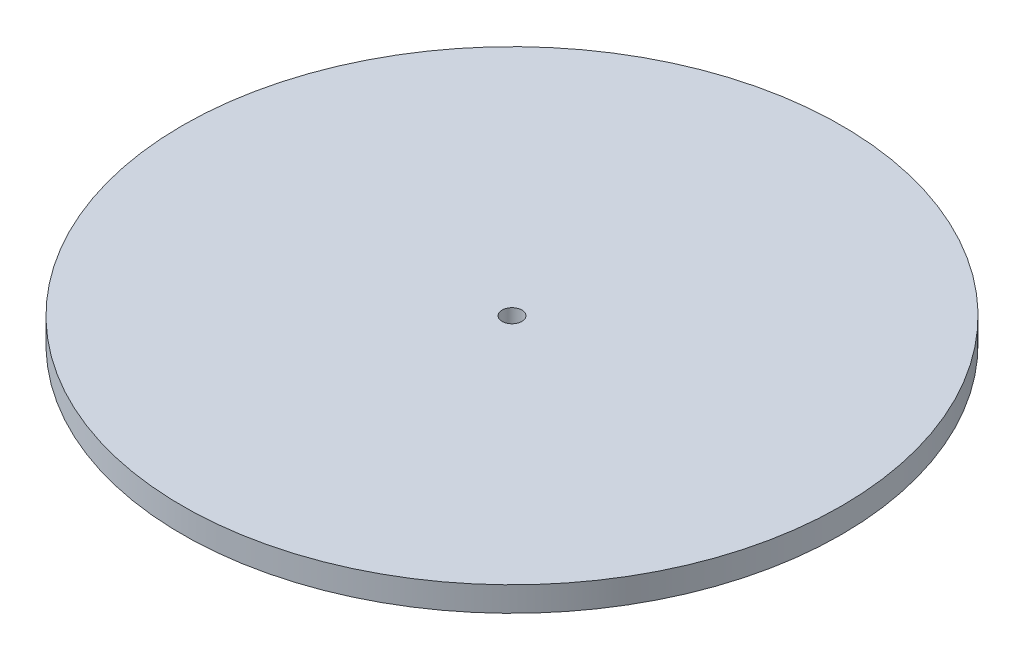
ISO-10303-21;
HEADER;
FILE_DESCRIPTION(('STEP AP214'),'2;1');
FILE_NAME('part.step','',(''),(''),'','','');
FILE_SCHEMA(('AUTOMOTIVE_DESIGN { 1 0 10303 214 1 1 1 1 }'));
ENDSEC;
DATA;
#1=APPLICATION_CONTEXT('core data for automotive mechanical design processes');
#2=APPLICATION_PROTOCOL_DEFINITION('international standard','automotive_design',2000,#1);
#3=PRODUCT_CONTEXT('',#1,'mechanical');
#4=PRODUCT('Part','Part','',(#3));
#5=PRODUCT_RELATED_PRODUCT_CATEGORY('part','',(#4));
#6=PRODUCT_DEFINITION_FORMATION('','',#4);
#7=PRODUCT_DEFINITION_CONTEXT('part definition',#1,'design');
#8=PRODUCT_DEFINITION('design','',#6,#7);
#9=PRODUCT_DEFINITION_SHAPE('','',#8);
#10=(LENGTH_UNIT() NAMED_UNIT(*) SI_UNIT(.MILLI.,.METRE.));
#11=(NAMED_UNIT(*) PLANE_ANGLE_UNIT() SI_UNIT($,.RADIAN.));
#12=(NAMED_UNIT(*) SI_UNIT($,.STERADIAN.) SOLID_ANGLE_UNIT());
#13=UNCERTAINTY_MEASURE_WITH_UNIT(LENGTH_MEASURE(1.E-05),#10,'distance_accuracy_value','');
#14=(GEOMETRIC_REPRESENTATION_CONTEXT(3) GLOBAL_UNCERTAINTY_ASSIGNED_CONTEXT((#13)) GLOBAL_UNIT_ASSIGNED_CONTEXT((#10,
#11,#12)) REPRESENTATION_CONTEXT('',''));
#15=CARTESIAN_POINT('',(0.,0.,0.));
#16=DIRECTION('',(0.,0.,1.));
#17=DIRECTION('',(1.,0.,0.));
#18=AXIS2_PLACEMENT_3D('',#15,#16,#17);
#19=CARTESIAN_POINT('',(0.,10.6124436187396,0.));
#20=DIRECTION('',(0.,1.,0.));
#21=DIRECTION('',(-1.,0.,0.));
#22=AXIS2_PLACEMENT_3D('',#19,#20,#21);
#23=CYLINDRICAL_SURFACE('',#22,40.);
#24=CARTESIAN_POINT('',(0.,10.6124436187397,0.));
#25=DIRECTION('',(0.,1.,0.));
#26=DIRECTION('',(-1.,0.,0.));
#27=AXIS2_PLACEMENT_3D('',#24,#25,#26);
#28=CIRCLE('',#27,40.);
#29=CARTESIAN_POINT('',(-40.,10.6124436187397,0.));
#30=VERTEX_POINT('',#29);
#31=EDGE_CURVE('E50',#30,#30,#28,.T.);
#32=ORIENTED_EDGE('',*,*,#31,.F.);
#33=EDGE_LOOP('',(#32));
#34=FACE_BOUND('',#33,.T.);
#35=CARTESIAN_POINT('',(0.,7.61244361873965,0.));
#36=DIRECTION('',(0.,1.,0.));
#37=DIRECTION('',(-1.,0.,0.));
#38=AXIS2_PLACEMENT_3D('',#35,#36,#37);
#39=CIRCLE('',#38,40.);
#40=CARTESIAN_POINT('',(-40.,7.61244361873965,0.));
#41=VERTEX_POINT('',#40);
#42=EDGE_CURVE('E10',#41,#41,#39,.T.);
#43=ORIENTED_EDGE('',*,*,#42,.T.);
#44=EDGE_LOOP('',(#43));
#45=FACE_BOUND('',#44,.T.);
#46=ADVANCED_FACE('F31',(#34,#45),#23,.T.);
#47=CARTESIAN_POINT('',(37.,7.61244361873965,0.));
#48=DIRECTION('',(0.,1.,0.));
#49=DIRECTION('',(-1.,0.,0.));
#50=AXIS2_PLACEMENT_3D('',#47,#48,#49);
#51=PLANE('',#50);
#52=ORIENTED_EDGE('',*,*,#42,.F.);
#53=EDGE_LOOP('',(#52));
#54=FACE_BOUND('',#53,.T.);
#55=CARTESIAN_POINT('',(0.,7.61244361873965,0.));
#56=DIRECTION('',(0.,1.,0.));
#57=DIRECTION('',(-1.,0.,0.));
#58=AXIS2_PLACEMENT_3D('',#55,#56,#57);
#59=CIRCLE('',#58,37.);
#60=CARTESIAN_POINT('',(-37.,7.61244361873965,0.));
#61=VERTEX_POINT('',#60);
#62=EDGE_CURVE('E37',#61,#61,#59,.T.);
#63=ORIENTED_EDGE('',*,*,#62,.T.);
#64=EDGE_LOOP('',(#63));
#65=FACE_BOUND('',#64,.T.);
#66=ADVANCED_FACE('F71',(#54,#65),#51,.F.);
#67=CARTESIAN_POINT('',(0.,10.6124436187396,0.));
#68=DIRECTION('',(0.,1.,0.));
#69=DIRECTION('',(-1.,0.,0.));
#70=AXIS2_PLACEMENT_3D('',#67,#68,#69);
#71=CYLINDRICAL_SURFACE('',#70,36.9999999998991);
#72=ORIENTED_EDGE('',*,*,#62,.F.);
#73=EDGE_LOOP('',(#72));
#74=FACE_BOUND('',#73,.T.);
#75=CARTESIAN_POINT('',(0.,6.61244361869023,0.));
#76=DIRECTION('',(0.,1.,0.));
#77=DIRECTION('',(-1.,0.,0.));
#78=AXIS2_PLACEMENT_3D('',#75,#76,#77);
#79=CIRCLE('',#78,36.9999999997983);
#80=CARTESIAN_POINT('',(-36.9999999997983,6.61244361869023,0.));
#81=VERTEX_POINT('',#80);
#82=EDGE_CURVE('E41',#81,#81,#79,.T.);
#83=ORIENTED_EDGE('',*,*,#82,.T.);
#84=EDGE_LOOP('',(#83));
#85=FACE_BOUND('',#84,.T.);
#86=ADVANCED_FACE('F67',(#74,#85),#71,.T.);
#87=CARTESIAN_POINT('',(4.02109985933596E-11,0.,0.));
#88=CARTESIAN_POINT('',(4.62499999913234,0.000824342711443618,0.));
#89=CARTESIAN_POINT('',(9.24999999863456,0.38749501614253,0.));
#90=CARTESIAN_POINT('',(13.8749999985762,1.18755217625845,0.));
#91=CARTESIAN_POINT('',(18.499999998711,2.16940369937497,0.));
#92=CARTESIAN_POINT('',(23.1249999989303,3.23081576849651,0.));
#93=CARTESIAN_POINT('',(27.7499999992104,4.34931624229754,0.));
#94=CARTESIAN_POINT('',(32.3749999995025,5.47916455129918,0.));
#95=CARTESIAN_POINT('',(36.9999999997983,6.61244361869023,0.));
#96=B_SPLINE_CURVE_WITH_KNOTS('',8,(#87,#88,#89,#90,#91,#92,#93,#94,#95),.UNSPECIFIED.,.F.,.F.,
(9,9),(0.0834147571603432,0.917562328572681),.UNSPECIFIED.);
#97=CARTESIAN_POINT('',(0.,10.6124436187396,0.));
#98=DIRECTION('',(0.,1.,0.));
#99=AXIS1_PLACEMENT('',#97,#98);
#100=SURFACE_OF_REVOLUTION('',#96,#99);
#101=CARTESIAN_POINT('',(0.,0.0116111993494726,0.));
#102=DIRECTION('',(0.,1.,0.));
#103=DIRECTION('',(-1.,0.,0.));
#104=AXIS2_PLACEMENT_3D('',#101,#102,#103);
#105=CIRCLE('',#104,1.2);
#106=CARTESIAN_POINT('',(-1.2,0.0116111993494726,0.));
#107=VERTEX_POINT('',#106);
#108=EDGE_CURVE('E53',#107,#107,#105,.T.);
#109=ORIENTED_EDGE('',*,*,#108,.T.);
#110=EDGE_LOOP('',(#109));
#111=FACE_BOUND('',#110,.T.);
#112=ORIENTED_EDGE('',*,*,#82,.F.);
#113=EDGE_LOOP('',(#112));
#114=FACE_BOUND('',#113,.T.);
#115=ADVANCED_FACE('F62',(#111,#114),#100,.T.);
#116=CARTESIAN_POINT('',(0.,10.6124436187396,0.));
#117=DIRECTION('',(0.,1.,0.));
#118=DIRECTION('',(-1.,0.,0.));
#119=AXIS2_PLACEMENT_3D('',#116,#117,#118);
#120=CYLINDRICAL_SURFACE('',#119,1.2);
#121=CARTESIAN_POINT('',(0.,10.6124436187396,0.));
#122=DIRECTION('',(0.,1.,0.));
#123=DIRECTION('',(-1.,0.,0.));
#124=AXIS2_PLACEMENT_3D('',#121,#122,#123);
#125=CIRCLE('',#124,1.2);
#126=CARTESIAN_POINT('',(-1.2,10.6124436187396,0.));
#127=VERTEX_POINT('',#126);
#128=EDGE_CURVE('E45',#127,#127,#125,.T.);
#129=ORIENTED_EDGE('',*,*,#128,.T.);
#130=EDGE_LOOP('',(#129));
#131=FACE_BOUND('',#130,.T.);
#132=ORIENTED_EDGE('',*,*,#108,.F.);
#133=EDGE_LOOP('',(#132));
#134=FACE_BOUND('',#133,.T.);
#135=ADVANCED_FACE('F66',(#131,#134),#120,.F.);
#136=CARTESIAN_POINT('',(40.,10.6124436187397,0.));
#137=DIRECTION('',(0.,-1.,0.));
#138=DIRECTION('',(1.,0.,0.));
#139=AXIS2_PLACEMENT_3D('',#136,#137,#138);
#140=PLANE('',#139);
#141=ORIENTED_EDGE('',*,*,#128,.F.);
#142=EDGE_LOOP('',(#141));
#143=FACE_BOUND('',#142,.T.);
#144=ORIENTED_EDGE('',*,*,#31,.T.);
#145=EDGE_LOOP('',(#144));
#146=FACE_BOUND('',#145,.T.);
#147=ADVANCED_FACE('F83',(#143,#146),#140,.F.);
#148=CLOSED_SHELL('',(#46,#66,#86,#115,#135,#147));
#149=MANIFOLD_SOLID_BREP('B2',#148);
#150=ADVANCED_BREP_SHAPE_REPRESENTATION('',(#18,#149),#14);
#151=SHAPE_DEFINITION_REPRESENTATION(#9,#150);
ENDSEC;
END-ISO-10303-21;
